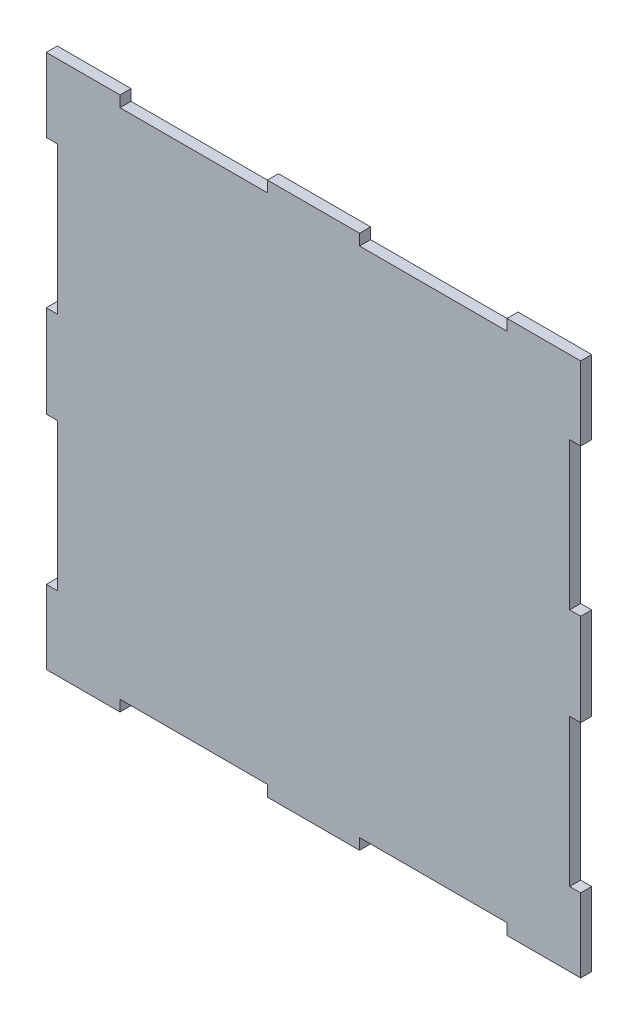
ISO-10303-21;
HEADER;
FILE_DESCRIPTION(('STEP AP214'),'2;1');
FILE_NAME('part.step','',(''),(''),'','','');
FILE_SCHEMA(('AUTOMOTIVE_DESIGN { 1 0 10303 214 1 1 1 1 }'));
ENDSEC;
DATA;
#1=APPLICATION_CONTEXT('core data for automotive mechanical design processes');
#2=APPLICATION_PROTOCOL_DEFINITION('international standard','automotive_design',2000,#1);
#3=PRODUCT_CONTEXT('',#1,'mechanical');
#4=PRODUCT('Part','Part','',(#3));
#5=PRODUCT_RELATED_PRODUCT_CATEGORY('part','',(#4));
#6=PRODUCT_DEFINITION_FORMATION('','',#4);
#7=PRODUCT_DEFINITION_CONTEXT('part definition',#1,'design');
#8=PRODUCT_DEFINITION('design','',#6,#7);
#9=PRODUCT_DEFINITION_SHAPE('','',#8);
#10=(LENGTH_UNIT() NAMED_UNIT(*) SI_UNIT(.MILLI.,.METRE.));
#11=(NAMED_UNIT(*) PLANE_ANGLE_UNIT() SI_UNIT($,.RADIAN.));
#12=(NAMED_UNIT(*) SI_UNIT($,.STERADIAN.) SOLID_ANGLE_UNIT());
#13=UNCERTAINTY_MEASURE_WITH_UNIT(LENGTH_MEASURE(1.E-05),#10,'distance_accuracy_value','');
#14=(GEOMETRIC_REPRESENTATION_CONTEXT(3) GLOBAL_UNCERTAINTY_ASSIGNED_CONTEXT((#13)) GLOBAL_UNIT_ASSIGNED_CONTEXT((#10,
#11,#12)) REPRESENTATION_CONTEXT('',''));
#15=CARTESIAN_POINT('',(0.,0.,0.));
#16=DIRECTION('',(0.,0.,1.));
#17=DIRECTION('',(1.,0.,0.));
#18=AXIS2_PLACEMENT_3D('',#15,#16,#17);
#19=CARTESIAN_POINT('',(72.5,72.5,3.));
#20=DIRECTION('',(-1.,0.,0.));
#21=DIRECTION('',(0.,-1.,0.));
#22=AXIS2_PLACEMENT_3D('',#19,#20,#21);
#23=PLANE('',#22);
#24=DIRECTION('',(0.,1.,0.));
#25=VECTOR('',#24,1.);
#26=CARTESIAN_POINT('',(72.5,72.5,3.));
#27=LINE('',#26,#25);
#28=CARTESIAN_POINT('',(72.5,-12.5,3.));
#29=VERTEX_POINT('',#28);
#30=CARTESIAN_POINT('',(72.5,12.5,3.));
#31=VERTEX_POINT('',#30);
#32=EDGE_CURVE('E378',#29,#31,#27,.T.);
#33=ORIENTED_EDGE('',*,*,#32,.F.);
#34=DIRECTION('',(0.,0.,1.));
#35=VECTOR('',#34,1.);
#36=CARTESIAN_POINT('',(72.5,-12.5,0.));
#37=LINE('',#36,#35);
#38=CARTESIAN_POINT('',(72.5,-12.5,0.));
#39=VERTEX_POINT('',#38);
#40=EDGE_CURVE('E407',#39,#29,#37,.T.);
#41=ORIENTED_EDGE('',*,*,#40,.F.);
#42=DIRECTION('',(0.,1.,0.));
#43=VECTOR('',#42,1.);
#44=CARTESIAN_POINT('',(72.5,72.5,0.));
#45=LINE('',#44,#43);
#46=CARTESIAN_POINT('',(72.5,12.5,0.));
#47=VERTEX_POINT('',#46);
#48=EDGE_CURVE('E346',#39,#47,#45,.T.);
#49=ORIENTED_EDGE('',*,*,#48,.T.);
#50=DIRECTION('',(0.,0.,1.));
#51=VECTOR('',#50,1.);
#52=CARTESIAN_POINT('',(72.5,12.5,0.));
#53=LINE('',#52,#51);
#54=EDGE_CURVE('E439',#47,#31,#53,.T.);
#55=ORIENTED_EDGE('',*,*,#54,.T.);
#56=EDGE_LOOP('',(#33,#41,#49,#55));
#57=FACE_BOUND('',#56,.T.);
#58=ADVANCED_FACE('F33',(#57),#23,.F.);
#59=CARTESIAN_POINT('',(72.5,52.5,3.));
#60=VERTEX_POINT('',#59);
#61=CARTESIAN_POINT('',(72.5,72.5,3.));
#62=VERTEX_POINT('',#61);
#63=EDGE_CURVE('E299',#60,#62,#27,.T.);
#64=ORIENTED_EDGE('',*,*,#63,.F.);
#65=DIRECTION('',(0.,0.,1.));
#66=VECTOR('',#65,1.);
#67=CARTESIAN_POINT('',(72.5,52.5,0.));
#68=LINE('',#67,#66);
#69=CARTESIAN_POINT('',(72.5,52.5,0.));
#70=VERTEX_POINT('',#69);
#71=EDGE_CURVE('E436',#70,#60,#68,.T.);
#72=ORIENTED_EDGE('',*,*,#71,.F.);
#73=CARTESIAN_POINT('',(72.5,72.5,0.));
#74=VERTEX_POINT('',#73);
#75=EDGE_CURVE('E347',#70,#74,#45,.T.);
#76=ORIENTED_EDGE('',*,*,#75,.T.);
#77=DIRECTION('',(0.,0.,-1.));
#78=VECTOR('',#77,1.);
#79=CARTESIAN_POINT('',(72.5,72.5,3.));
#80=LINE('',#79,#78);
#81=EDGE_CURVE('E11',#62,#74,#80,.T.);
#82=ORIENTED_EDGE('',*,*,#81,.F.);
#83=EDGE_LOOP('',(#64,#72,#76,#82));
#84=FACE_BOUND('',#83,.T.);
#85=ADVANCED_FACE('F569',(#84),#23,.F.);
#86=CARTESIAN_POINT('',(-72.5,72.5,3.));
#87=DIRECTION('',(0.,-1.,0.));
#88=DIRECTION('',(0.,0.,-1.));
#89=AXIS2_PLACEMENT_3D('',#86,#87,#88);
#90=PLANE('',#89);
#91=DIRECTION('',(-1.,0.,0.));
#92=VECTOR('',#91,1.);
#93=CARTESIAN_POINT('',(-72.5,72.5,3.));
#94=LINE('',#93,#92);
#95=CARTESIAN_POINT('',(12.5,72.5,3.));
#96=VERTEX_POINT('',#95);
#97=CARTESIAN_POINT('',(-12.5,72.5,3.));
#98=VERTEX_POINT('',#97);
#99=EDGE_CURVE('E383',#96,#98,#94,.T.);
#100=ORIENTED_EDGE('',*,*,#99,.F.);
#101=DIRECTION('',(0.,0.,1.));
#102=VECTOR('',#101,1.);
#103=CARTESIAN_POINT('',(12.5,72.5,0.));
#104=LINE('',#103,#102);
#105=CARTESIAN_POINT('',(12.5,72.5,0.));
#106=VERTEX_POINT('',#105);
#107=EDGE_CURVE('E462',#106,#96,#104,.T.);
#108=ORIENTED_EDGE('',*,*,#107,.F.);
#109=DIRECTION('',(-1.,0.,0.));
#110=VECTOR('',#109,1.);
#111=CARTESIAN_POINT('',(-72.5,72.5,0.));
#112=LINE('',#111,#110);
#113=CARTESIAN_POINT('',(-12.5,72.5,0.));
#114=VERTEX_POINT('',#113);
#115=EDGE_CURVE('E337',#106,#114,#112,.T.);
#116=ORIENTED_EDGE('',*,*,#115,.T.);
#117=DIRECTION('',(0.,0.,1.));
#118=VECTOR('',#117,1.);
#119=CARTESIAN_POINT('',(-12.5,72.5,0.));
#120=LINE('',#119,#118);
#121=EDGE_CURVE('E358',#114,#98,#120,.T.);
#122=ORIENTED_EDGE('',*,*,#121,.T.);
#123=EDGE_LOOP('',(#100,#108,#116,#122));
#124=FACE_BOUND('',#123,.T.);
#125=ADVANCED_FACE('F555',(#124),#90,.F.);
#126=CARTESIAN_POINT('',(-52.5,72.5,3.));
#127=VERTEX_POINT('',#126);
#128=CARTESIAN_POINT('',(-72.5,72.5,3.));
#129=VERTEX_POINT('',#128);
#130=EDGE_CURVE('E377',#127,#129,#94,.T.);
#131=ORIENTED_EDGE('',*,*,#130,.F.);
#132=DIRECTION('',(0.,0.,1.));
#133=VECTOR('',#132,1.);
#134=CARTESIAN_POINT('',(-52.5,72.5,0.));
#135=LINE('',#134,#133);
#136=CARTESIAN_POINT('',(-52.5,72.5,0.));
#137=VERTEX_POINT('',#136);
#138=EDGE_CURVE('E353',#137,#127,#135,.T.);
#139=ORIENTED_EDGE('',*,*,#138,.F.);
#140=CARTESIAN_POINT('',(-72.5,72.5,0.));
#141=VERTEX_POINT('',#140);
#142=EDGE_CURVE('E325',#137,#141,#112,.T.);
#143=ORIENTED_EDGE('',*,*,#142,.T.);
#144=DIRECTION('',(0.,0.,-1.));
#145=VECTOR('',#144,1.);
#146=CARTESIAN_POINT('',(-72.5,72.5,3.));
#147=LINE('',#146,#145);
#148=EDGE_CURVE('E41',#129,#141,#147,.T.);
#149=ORIENTED_EDGE('',*,*,#148,.F.);
#150=EDGE_LOOP('',(#131,#139,#143,#149));
#151=FACE_BOUND('',#150,.T.);
#152=ADVANCED_FACE('F559',(#151),#90,.F.);
#153=CARTESIAN_POINT('',(-72.5,72.5,3.));
#154=DIRECTION('',(1.,0.,0.));
#155=DIRECTION('',(0.,0.,-1.));
#156=AXIS2_PLACEMENT_3D('',#153,#154,#155);
#157=PLANE('',#156);
#158=DIRECTION('',(0.,-1.,0.));
#159=VECTOR('',#158,1.);
#160=CARTESIAN_POINT('',(-72.5,72.5,0.));
#161=LINE('',#160,#159);
#162=CARTESIAN_POINT('',(-72.5,52.5,0.));
#163=VERTEX_POINT('',#162);
#164=EDGE_CURVE('E300',#141,#163,#161,.T.);
#165=ORIENTED_EDGE('',*,*,#164,.T.);
#166=DIRECTION('',(0.,0.,1.));
#167=VECTOR('',#166,1.);
#168=CARTESIAN_POINT('',(-72.5,52.5,0.));
#169=LINE('',#168,#167);
#170=CARTESIAN_POINT('',(-72.5,52.5,3.));
#171=VERTEX_POINT('',#170);
#172=EDGE_CURVE('E458',#163,#171,#169,.T.);
#173=ORIENTED_EDGE('',*,*,#172,.T.);
#174=DIRECTION('',(0.,-1.,0.));
#175=VECTOR('',#174,1.);
#176=CARTESIAN_POINT('',(-72.5,72.5,3.));
#177=LINE('',#176,#175);
#178=EDGE_CURVE('E319',#129,#171,#177,.T.);
#179=ORIENTED_EDGE('',*,*,#178,.F.);
#180=ORIENTED_EDGE('',*,*,#148,.T.);
#181=EDGE_LOOP('',(#165,#173,#179,#180));
#182=FACE_BOUND('',#181,.T.);
#183=ADVANCED_FACE('F316',(#182),#157,.F.);
#184=CARTESIAN_POINT('',(-72.5,12.5,3.));
#185=VERTEX_POINT('',#184);
#186=CARTESIAN_POINT('',(-72.5,-12.5,3.));
#187=VERTEX_POINT('',#186);
#188=EDGE_CURVE('E385',#185,#187,#177,.T.);
#189=ORIENTED_EDGE('',*,*,#188,.F.);
#190=DIRECTION('',(0.,0.,1.));
#191=VECTOR('',#190,1.);
#192=CARTESIAN_POINT('',(-72.5,12.5,0.));
#193=LINE('',#192,#191);
#194=CARTESIAN_POINT('',(-72.5,12.5,0.));
#195=VERTEX_POINT('',#194);
#196=EDGE_CURVE('E476',#195,#185,#193,.T.);
#197=ORIENTED_EDGE('',*,*,#196,.F.);
#198=CARTESIAN_POINT('',(-72.5,-12.5,0.));
#199=VERTEX_POINT('',#198);
#200=EDGE_CURVE('E328',#195,#199,#161,.T.);
#201=ORIENTED_EDGE('',*,*,#200,.T.);
#202=DIRECTION('',(0.,0.,1.));
#203=VECTOR('',#202,1.);
#204=CARTESIAN_POINT('',(-72.5,-12.5,0.));
#205=LINE('',#204,#203);
#206=EDGE_CURVE('E481',#199,#187,#205,.T.);
#207=ORIENTED_EDGE('',*,*,#206,.T.);
#208=EDGE_LOOP('',(#189,#197,#201,#207));
#209=FACE_BOUND('',#208,.T.);
#210=ADVANCED_FACE('F566',(#209),#157,.F.);
#211=CARTESIAN_POINT('',(-72.5,-72.5,3.));
#212=DIRECTION('',(0.,1.,0.));
#213=DIRECTION('',(0.,0.,1.));
#214=AXIS2_PLACEMENT_3D('',#211,#212,#213);
#215=PLANE('',#214);
#216=DIRECTION('',(1.,0.,0.));
#217=VECTOR('',#216,1.);
#218=CARTESIAN_POINT('',(-72.5,-72.5,0.));
#219=LINE('',#218,#217);
#220=CARTESIAN_POINT('',(-12.5,-72.5,0.));
#221=VERTEX_POINT('',#220);
#222=CARTESIAN_POINT('',(12.5,-72.5,0.));
#223=VERTEX_POINT('',#222);
#224=EDGE_CURVE('E284',#221,#223,#219,.T.);
#225=ORIENTED_EDGE('',*,*,#224,.T.);
#226=DIRECTION('',(0.,0.,1.));
#227=VECTOR('',#226,1.);
#228=CARTESIAN_POINT('',(12.5,-72.5,0.));
#229=LINE('',#228,#227);
#230=CARTESIAN_POINT('',(12.5,-72.5,3.));
#231=VERTEX_POINT('',#230);
#232=EDGE_CURVE('E506',#223,#231,#229,.T.);
#233=ORIENTED_EDGE('',*,*,#232,.T.);
#234=DIRECTION('',(1.,0.,0.));
#235=VECTOR('',#234,1.);
#236=CARTESIAN_POINT('',(-72.5,-72.5,3.));
#237=LINE('',#236,#235);
#238=CARTESIAN_POINT('',(-12.5,-72.5,3.));
#239=VERTEX_POINT('',#238);
#240=EDGE_CURVE('E286',#239,#231,#237,.T.);
#241=ORIENTED_EDGE('',*,*,#240,.F.);
#242=DIRECTION('',(0.,0.,1.));
#243=VECTOR('',#242,1.);
#244=CARTESIAN_POINT('',(-12.5,-72.5,0.));
#245=LINE('',#244,#243);
#246=EDGE_CURVE('E270',#221,#239,#245,.T.);
#247=ORIENTED_EDGE('',*,*,#246,.F.);
#248=EDGE_LOOP('',(#225,#233,#241,#247));
#249=FACE_BOUND('',#248,.T.);
#250=ADVANCED_FACE('F282',(#249),#215,.F.);
#251=CARTESIAN_POINT('',(-72.5,-72.5,0.));
#252=VERTEX_POINT('',#251);
#253=CARTESIAN_POINT('',(-52.5,-72.5,0.));
#254=VERTEX_POINT('',#253);
#255=EDGE_CURVE('E295',#252,#254,#219,.T.);
#256=ORIENTED_EDGE('',*,*,#255,.T.);
#257=DIRECTION('',(0.,0.,1.));
#258=VECTOR('',#257,1.);
#259=CARTESIAN_POINT('',(-52.5,-72.5,0.));
#260=LINE('',#259,#258);
#261=CARTESIAN_POINT('',(-52.5,-72.5,3.));
#262=VERTEX_POINT('',#261);
#263=EDGE_CURVE('E527',#254,#262,#260,.T.);
#264=ORIENTED_EDGE('',*,*,#263,.T.);
#265=CARTESIAN_POINT('',(-72.5,-72.5,3.));
#266=VERTEX_POINT('',#265);
#267=EDGE_CURVE('E308',#266,#262,#237,.T.);
#268=ORIENTED_EDGE('',*,*,#267,.F.);
#269=DIRECTION('',(0.,0.,-1.));
#270=VECTOR('',#269,1.);
#271=CARTESIAN_POINT('',(-72.5,-72.5,3.));
#272=LINE('',#271,#270);
#273=EDGE_CURVE('E307',#266,#252,#272,.T.);
#274=ORIENTED_EDGE('',*,*,#273,.T.);
#275=EDGE_LOOP('',(#256,#264,#268,#274));
#276=FACE_BOUND('',#275,.T.);
#277=ADVANCED_FACE('F578',(#276),#215,.F.);
#278=CARTESIAN_POINT('',(72.5,-72.5,0.));
#279=VERTEX_POINT('',#278);
#280=CARTESIAN_POINT('',(72.5,-52.5,0.));
#281=VERTEX_POINT('',#280);
#282=EDGE_CURVE('E343',#279,#281,#45,.T.);
#283=ORIENTED_EDGE('',*,*,#282,.T.);
#284=DIRECTION('',(0.,0.,1.));
#285=VECTOR('',#284,1.);
#286=CARTESIAN_POINT('',(72.5,-52.5,0.));
#287=LINE('',#286,#285);
#288=CARTESIAN_POINT('',(72.5,-52.5,3.));
#289=VERTEX_POINT('',#288);
#290=EDGE_CURVE('E404',#281,#289,#287,.T.);
#291=ORIENTED_EDGE('',*,*,#290,.T.);
#292=CARTESIAN_POINT('',(72.5,-72.5,3.));
#293=VERTEX_POINT('',#292);
#294=EDGE_CURVE('E374',#293,#289,#27,.T.);
#295=ORIENTED_EDGE('',*,*,#294,.F.);
#296=DIRECTION('',(0.,0.,-1.));
#297=VECTOR('',#296,1.);
#298=CARTESIAN_POINT('',(72.5,-72.5,3.));
#299=LINE('',#298,#297);
#300=EDGE_CURVE('E304',#293,#279,#299,.T.);
#301=ORIENTED_EDGE('',*,*,#300,.T.);
#302=EDGE_LOOP('',(#283,#291,#295,#301));
#303=FACE_BOUND('',#302,.T.);
#304=ADVANCED_FACE('F35',(#303),#23,.F.);
#305=CARTESIAN_POINT('',(52.5,72.5,0.));
#306=VERTEX_POINT('',#305);
#307=EDGE_CURVE('E331',#74,#306,#112,.T.);
#308=ORIENTED_EDGE('',*,*,#307,.T.);
#309=DIRECTION('',(0.,0.,1.));
#310=VECTOR('',#309,1.);
#311=CARTESIAN_POINT('',(52.5,72.5,0.));
#312=LINE('',#311,#310);
#313=CARTESIAN_POINT('',(52.5,72.5,3.));
#314=VERTEX_POINT('',#313);
#315=EDGE_CURVE('E465',#306,#314,#312,.T.);
#316=ORIENTED_EDGE('',*,*,#315,.T.);
#317=EDGE_CURVE('E379',#62,#314,#94,.T.);
#318=ORIENTED_EDGE('',*,*,#317,.F.);
#319=ORIENTED_EDGE('',*,*,#81,.T.);
#320=EDGE_LOOP('',(#308,#316,#318,#319));
#321=FACE_BOUND('',#320,.T.);
#322=ADVANCED_FACE('F561',(#321),#90,.F.);
#323=CARTESIAN_POINT('',(-72.5,-52.5,3.));
#324=VERTEX_POINT('',#323);
#325=EDGE_CURVE('E382',#324,#266,#177,.T.);
#326=ORIENTED_EDGE('',*,*,#325,.F.);
#327=DIRECTION('',(0.,0.,1.));
#328=VECTOR('',#327,1.);
#329=CARTESIAN_POINT('',(-72.5,-52.5,0.));
#330=LINE('',#329,#328);
#331=CARTESIAN_POINT('',(-72.5,-52.5,0.));
#332=VERTEX_POINT('',#331);
#333=EDGE_CURVE('E501',#332,#324,#330,.T.);
#334=ORIENTED_EDGE('',*,*,#333,.F.);
#335=EDGE_CURVE('E329',#332,#252,#161,.T.);
#336=ORIENTED_EDGE('',*,*,#335,.T.);
#337=ORIENTED_EDGE('',*,*,#273,.F.);
#338=EDGE_LOOP('',(#326,#334,#336,#337));
#339=FACE_BOUND('',#338,.T.);
#340=ADVANCED_FACE('F568',(#339),#157,.F.);
#341=CARTESIAN_POINT('',(52.5,-72.5,3.));
#342=VERTEX_POINT('',#341);
#343=EDGE_CURVE('E384',#342,#293,#237,.T.);
#344=ORIENTED_EDGE('',*,*,#343,.F.);
#345=DIRECTION('',(0.,0.,1.));
#346=VECTOR('',#345,1.);
#347=CARTESIAN_POINT('',(52.5,-72.5,0.));
#348=LINE('',#347,#346);
#349=CARTESIAN_POINT('',(52.5,-72.5,0.));
#350=VERTEX_POINT('',#349);
#351=EDGE_CURVE('E524',#350,#342,#348,.T.);
#352=ORIENTED_EDGE('',*,*,#351,.F.);
#353=EDGE_CURVE('E296',#350,#279,#219,.T.);
#354=ORIENTED_EDGE('',*,*,#353,.T.);
#355=ORIENTED_EDGE('',*,*,#300,.F.);
#356=EDGE_LOOP('',(#344,#352,#354,#355));
#357=FACE_BOUND('',#356,.T.);
#358=ADVANCED_FACE('F402',(#357),#215,.F.);
#359=CARTESIAN_POINT('',(0.,0.,3.));
#360=DIRECTION('',(0.,0.,1.));
#361=DIRECTION('',(1.,0.,0.));
#362=AXIS2_PLACEMENT_3D('',#359,#360,#361);
#363=PLANE('',#362);
#364=DIRECTION('',(0.,-1.,0.));
#365=VECTOR('',#364,1.);
#366=CARTESIAN_POINT('',(12.5,72.5,3.));
#367=LINE('',#366,#365);
#368=CARTESIAN_POINT('',(12.5,69.5,3.));
#369=VERTEX_POINT('',#368);
#370=EDGE_CURVE('E454',#96,#369,#367,.T.);
#371=ORIENTED_EDGE('',*,*,#370,.F.);
#372=ORIENTED_EDGE('',*,*,#99,.T.);
#373=DIRECTION('',(0.,1.,0.));
#374=VECTOR('',#373,1.);
#375=CARTESIAN_POINT('',(-12.5,72.5,3.));
#376=LINE('',#375,#374);
#377=CARTESIAN_POINT('',(-12.5,69.5,3.));
#378=VERTEX_POINT('',#377);
#379=EDGE_CURVE('E367',#378,#98,#376,.T.);
#380=ORIENTED_EDGE('',*,*,#379,.F.);
#381=DIRECTION('',(1.,0.,0.));
#382=VECTOR('',#381,1.);
#383=CARTESIAN_POINT('',(-52.5,69.5,3.));
#384=LINE('',#383,#382);
#385=CARTESIAN_POINT('',(-52.5,69.5,3.));
#386=VERTEX_POINT('',#385);
#387=EDGE_CURVE('E544',#386,#378,#384,.T.);
#388=ORIENTED_EDGE('',*,*,#387,.F.);
#389=DIRECTION('',(0.,-1.,0.));
#390=VECTOR('',#389,1.);
#391=CARTESIAN_POINT('',(-52.5,72.5,3.));
#392=LINE('',#391,#390);
#393=EDGE_CURVE('E464',#127,#386,#392,.T.);
#394=ORIENTED_EDGE('',*,*,#393,.F.);
#395=ORIENTED_EDGE('',*,*,#130,.T.);
#396=ORIENTED_EDGE('',*,*,#178,.T.);
#397=DIRECTION('',(-1.,0.,0.));
#398=VECTOR('',#397,1.);
#399=CARTESIAN_POINT('',(-72.5,52.5,3.));
#400=LINE('',#399,#398);
#401=CARTESIAN_POINT('',(-69.5,52.5,3.));
#402=VERTEX_POINT('',#401);
#403=EDGE_CURVE('E473',#402,#171,#400,.T.);
#404=ORIENTED_EDGE('',*,*,#403,.F.);
#405=DIRECTION('',(0.,1.,0.));
#406=VECTOR('',#405,1.);
#407=CARTESIAN_POINT('',(-69.5,52.5,3.));
#408=LINE('',#407,#406);
#409=CARTESIAN_POINT('',(-69.5,12.5,3.));
#410=VERTEX_POINT('',#409);
#411=EDGE_CURVE('E480',#410,#402,#408,.T.);
#412=ORIENTED_EDGE('',*,*,#411,.F.);
#413=DIRECTION('',(1.,0.,0.));
#414=VECTOR('',#413,1.);
#415=CARTESIAN_POINT('',(-72.5,12.5,3.));
#416=LINE('',#415,#414);
#417=EDGE_CURVE('E477',#185,#410,#416,.T.);
#418=ORIENTED_EDGE('',*,*,#417,.F.);
#419=ORIENTED_EDGE('',*,*,#188,.T.);
#420=DIRECTION('',(-1.,0.,0.));
#421=VECTOR('',#420,1.);
#422=CARTESIAN_POINT('',(-72.5,-12.5,3.));
#423=LINE('',#422,#421);
#424=CARTESIAN_POINT('',(-69.5,-12.5,3.));
#425=VERTEX_POINT('',#424);
#426=EDGE_CURVE('E495',#425,#187,#423,.T.);
#427=ORIENTED_EDGE('',*,*,#426,.F.);
#428=DIRECTION('',(0.,1.,0.));
#429=VECTOR('',#428,1.);
#430=CARTESIAN_POINT('',(-69.5,-12.5,3.));
#431=LINE('',#430,#429);
#432=CARTESIAN_POINT('',(-69.5,-52.5,3.));
#433=VERTEX_POINT('',#432);
#434=EDGE_CURVE('E505',#433,#425,#431,.T.);
#435=ORIENTED_EDGE('',*,*,#434,.F.);
#436=DIRECTION('',(1.,0.,0.));
#437=VECTOR('',#436,1.);
#438=CARTESIAN_POINT('',(-72.5,-52.5,3.));
#439=LINE('',#438,#437);
#440=EDGE_CURVE('E502',#324,#433,#439,.T.);
#441=ORIENTED_EDGE('',*,*,#440,.F.);
#442=ORIENTED_EDGE('',*,*,#325,.T.);
#443=ORIENTED_EDGE('',*,*,#267,.T.);
#444=DIRECTION('',(0.,-1.,0.));
#445=VECTOR('',#444,1.);
#446=CARTESIAN_POINT('',(-52.5,-72.5,3.));
#447=LINE('',#446,#445);
#448=CARTESIAN_POINT('',(-52.5,-69.5,3.));
#449=VERTEX_POINT('',#448);
#450=EDGE_CURVE('E277',#449,#262,#447,.T.);
#451=ORIENTED_EDGE('',*,*,#450,.F.);
#452=DIRECTION('',(-1.,0.,0.));
#453=VECTOR('',#452,1.);
#454=CARTESIAN_POINT('',(-52.5,-69.5,3.));
#455=LINE('',#454,#453);
#456=CARTESIAN_POINT('',(-12.5,-69.5,3.));
#457=VERTEX_POINT('',#456);
#458=EDGE_CURVE('E743',#457,#449,#455,.T.);
#459=ORIENTED_EDGE('',*,*,#458,.F.);
#460=DIRECTION('',(0.,1.,0.));
#461=VECTOR('',#460,1.);
#462=CARTESIAN_POINT('',(-12.5,-72.5,3.));
#463=LINE('',#462,#461);
#464=EDGE_CURVE('E410',#239,#457,#463,.T.);
#465=ORIENTED_EDGE('',*,*,#464,.F.);
#466=ORIENTED_EDGE('',*,*,#240,.T.);
#467=DIRECTION('',(0.,-1.,0.));
#468=VECTOR('',#467,1.);
#469=CARTESIAN_POINT('',(12.5,-72.5,3.));
#470=LINE('',#469,#468);
#471=CARTESIAN_POINT('',(12.5,-69.5,3.));
#472=VERTEX_POINT('',#471);
#473=EDGE_CURVE('E521',#472,#231,#470,.T.);
#474=ORIENTED_EDGE('',*,*,#473,.F.);
#475=DIRECTION('',(-1.,0.,0.));
#476=VECTOR('',#475,1.);
#477=CARTESIAN_POINT('',(12.5,-69.5,3.));
#478=LINE('',#477,#476);
#479=CARTESIAN_POINT('',(52.5,-69.5,3.));
#480=VERTEX_POINT('',#479);
#481=EDGE_CURVE('E526',#480,#472,#478,.T.);
#482=ORIENTED_EDGE('',*,*,#481,.F.);
#483=DIRECTION('',(0.,1.,0.));
#484=VECTOR('',#483,1.);
#485=CARTESIAN_POINT('',(52.5,-72.5,3.));
#486=LINE('',#485,#484);
#487=EDGE_CURVE('E399',#342,#480,#486,.T.);
#488=ORIENTED_EDGE('',*,*,#487,.F.);
#489=ORIENTED_EDGE('',*,*,#343,.T.);
#490=ORIENTED_EDGE('',*,*,#294,.T.);
#491=DIRECTION('',(1.,0.,0.));
#492=VECTOR('',#491,1.);
#493=CARTESIAN_POINT('',(72.5,-52.5,3.));
#494=LINE('',#493,#492);
#495=CARTESIAN_POINT('',(69.5,-52.5,3.));
#496=VERTEX_POINT('',#495);
#497=EDGE_CURVE('E625',#496,#289,#494,.T.);
#498=ORIENTED_EDGE('',*,*,#497,.F.);
#499=DIRECTION('',(0.,-1.,0.));
#500=VECTOR('',#499,1.);
#501=CARTESIAN_POINT('',(69.5,-12.5,3.));
#502=LINE('',#501,#500);
#503=CARTESIAN_POINT('',(69.5,-12.5,3.));
#504=VERTEX_POINT('',#503);
#505=EDGE_CURVE('E631',#504,#496,#502,.T.);
#506=ORIENTED_EDGE('',*,*,#505,.F.);
#507=DIRECTION('',(-1.,0.,0.));
#508=VECTOR('',#507,1.);
#509=CARTESIAN_POINT('',(72.5,-12.5,3.));
#510=LINE('',#509,#508);
#511=EDGE_CURVE('E438',#29,#504,#510,.T.);
#512=ORIENTED_EDGE('',*,*,#511,.F.);
#513=ORIENTED_EDGE('',*,*,#32,.T.);
#514=DIRECTION('',(1.,0.,0.));
#515=VECTOR('',#514,1.);
#516=CARTESIAN_POINT('',(72.5,12.5,3.));
#517=LINE('',#516,#515);
#518=CARTESIAN_POINT('',(69.5,12.5,3.));
#519=VERTEX_POINT('',#518);
#520=EDGE_CURVE('E422',#519,#31,#517,.T.);
#521=ORIENTED_EDGE('',*,*,#520,.F.);
#522=DIRECTION('',(0.,-1.,0.));
#523=VECTOR('',#522,1.);
#524=CARTESIAN_POINT('',(69.5,52.5,3.));
#525=LINE('',#524,#523);
#526=CARTESIAN_POINT('',(69.5,52.5,3.));
#527=VERTEX_POINT('',#526);
#528=EDGE_CURVE('E432',#527,#519,#525,.T.);
#529=ORIENTED_EDGE('',*,*,#528,.F.);
#530=DIRECTION('',(-1.,0.,0.));
#531=VECTOR('',#530,1.);
#532=CARTESIAN_POINT('',(72.5,52.5,3.));
#533=LINE('',#532,#531);
#534=EDGE_CURVE('E429',#60,#527,#533,.T.);
#535=ORIENTED_EDGE('',*,*,#534,.F.);
#536=ORIENTED_EDGE('',*,*,#63,.T.);
#537=ORIENTED_EDGE('',*,*,#317,.T.);
#538=DIRECTION('',(0.,1.,0.));
#539=VECTOR('',#538,1.);
#540=CARTESIAN_POINT('',(52.5,72.5,3.));
#541=LINE('',#540,#539);
#542=CARTESIAN_POINT('',(52.5,69.5,3.));
#543=VERTEX_POINT('',#542);
#544=EDGE_CURVE('E449',#543,#314,#541,.T.);
#545=ORIENTED_EDGE('',*,*,#544,.F.);
#546=DIRECTION('',(1.,0.,0.));
#547=VECTOR('',#546,1.);
#548=CARTESIAN_POINT('',(12.5,69.5,3.));
#549=LINE('',#548,#547);
#550=EDGE_CURVE('E457',#369,#543,#549,.T.);
#551=ORIENTED_EDGE('',*,*,#550,.F.);
#552=EDGE_LOOP('',(#371,#372,#380,#388,#394,#395,#396,#404,#412,#418,#419,#427,#435,#441,#442,
#443,#451,#459,#465,#466,#474,#482,#488,#489,#490,#498,#506,#512,#513,#521,#529,#535,#536,#537,
#545,#551));
#553=FACE_BOUND('',#552,.T.);
#554=ADVANCED_FACE('F394',(#553),#363,.T.);
#555=CARTESIAN_POINT('',(0.,0.,0.));
#556=DIRECTION('',(0.,0.,1.));
#557=DIRECTION('',(1.,0.,0.));
#558=AXIS2_PLACEMENT_3D('',#555,#556,#557);
#559=PLANE('',#558);
#560=ORIENTED_EDGE('',*,*,#115,.F.);
#561=DIRECTION('',(0.,-1.,0.));
#562=VECTOR('',#561,1.);
#563=CARTESIAN_POINT('',(12.5,72.5,0.));
#564=LINE('',#563,#562);
#565=CARTESIAN_POINT('',(12.5,69.5,0.));
#566=VERTEX_POINT('',#565);
#567=EDGE_CURVE('E445',#106,#566,#564,.T.);
#568=ORIENTED_EDGE('',*,*,#567,.T.);
#569=DIRECTION('',(1.,0.,0.));
#570=VECTOR('',#569,1.);
#571=CARTESIAN_POINT('',(12.5,69.5,0.));
#572=LINE('',#571,#570);
#573=CARTESIAN_POINT('',(52.5,69.5,0.));
#574=VERTEX_POINT('',#573);
#575=EDGE_CURVE('E448',#566,#574,#572,.T.);
#576=ORIENTED_EDGE('',*,*,#575,.T.);
#577=DIRECTION('',(0.,1.,0.));
#578=VECTOR('',#577,1.);
#579=CARTESIAN_POINT('',(52.5,72.5,0.));
#580=LINE('',#579,#578);
#581=EDGE_CURVE('E48',#574,#306,#580,.T.);
#582=ORIENTED_EDGE('',*,*,#581,.T.);
#583=ORIENTED_EDGE('',*,*,#307,.F.);
#584=ORIENTED_EDGE('',*,*,#75,.F.);
#585=DIRECTION('',(-1.,0.,0.));
#586=VECTOR('',#585,1.);
#587=CARTESIAN_POINT('',(72.5,52.5,0.));
#588=LINE('',#587,#586);
#589=CARTESIAN_POINT('',(69.5,52.5,0.));
#590=VERTEX_POINT('',#589);
#591=EDGE_CURVE('E418',#70,#590,#588,.T.);
#592=ORIENTED_EDGE('',*,*,#591,.T.);
#593=DIRECTION('',(0.,-1.,0.));
#594=VECTOR('',#593,1.);
#595=CARTESIAN_POINT('',(69.5,52.5,0.));
#596=LINE('',#595,#594);
#597=CARTESIAN_POINT('',(69.5,12.5,0.));
#598=VERTEX_POINT('',#597);
#599=EDGE_CURVE('E421',#590,#598,#596,.T.);
#600=ORIENTED_EDGE('',*,*,#599,.T.);
#601=DIRECTION('',(1.,0.,0.));
#602=VECTOR('',#601,1.);
#603=CARTESIAN_POINT('',(72.5,12.5,0.));
#604=LINE('',#603,#602);
#605=EDGE_CURVE('E425',#598,#47,#604,.T.);
#606=ORIENTED_EDGE('',*,*,#605,.T.);
#607=ORIENTED_EDGE('',*,*,#48,.F.);
#608=DIRECTION('',(-1.,0.,0.));
#609=VECTOR('',#608,1.);
#610=CARTESIAN_POINT('',(72.5,-12.5,0.));
#611=LINE('',#610,#609);
#612=CARTESIAN_POINT('',(69.5,-12.5,0.));
#613=VERTEX_POINT('',#612);
#614=EDGE_CURVE('E621',#39,#613,#611,.T.);
#615=ORIENTED_EDGE('',*,*,#614,.T.);
#616=DIRECTION('',(0.,-1.,0.));
#617=VECTOR('',#616,1.);
#618=CARTESIAN_POINT('',(69.5,-12.5,0.));
#619=LINE('',#618,#617);
#620=CARTESIAN_POINT('',(69.5,-52.5,0.));
#621=VERTEX_POINT('',#620);
#622=EDGE_CURVE('E624',#613,#621,#619,.T.);
#623=ORIENTED_EDGE('',*,*,#622,.T.);
#624=DIRECTION('',(1.,0.,0.));
#625=VECTOR('',#624,1.);
#626=CARTESIAN_POINT('',(72.5,-52.5,0.));
#627=LINE('',#626,#625);
#628=EDGE_CURVE('E417',#621,#281,#627,.T.);
#629=ORIENTED_EDGE('',*,*,#628,.T.);
#630=ORIENTED_EDGE('',*,*,#282,.F.);
#631=ORIENTED_EDGE('',*,*,#353,.F.);
#632=DIRECTION('',(0.,1.,0.));
#633=VECTOR('',#632,1.);
#634=CARTESIAN_POINT('',(52.5,-72.5,0.));
#635=LINE('',#634,#633);
#636=CARTESIAN_POINT('',(52.5,-69.5,0.));
#637=VERTEX_POINT('',#636);
#638=EDGE_CURVE('E517',#350,#637,#635,.T.);
#639=ORIENTED_EDGE('',*,*,#638,.T.);
#640=DIRECTION('',(-1.,0.,0.));
#641=VECTOR('',#640,1.);
#642=CARTESIAN_POINT('',(12.5,-69.5,0.));
#643=LINE('',#642,#641);
#644=CARTESIAN_POINT('',(12.5,-69.5,0.));
#645=VERTEX_POINT('',#644);
#646=EDGE_CURVE('E520',#637,#645,#643,.T.);
#647=ORIENTED_EDGE('',*,*,#646,.T.);
#648=DIRECTION('',(0.,-1.,0.));
#649=VECTOR('',#648,1.);
#650=CARTESIAN_POINT('',(12.5,-72.5,0.));
#651=LINE('',#650,#649);
#652=EDGE_CURVE('E294',#645,#223,#651,.T.);
#653=ORIENTED_EDGE('',*,*,#652,.T.);
#654=ORIENTED_EDGE('',*,*,#224,.F.);
#655=DIRECTION('',(0.,1.,0.));
#656=VECTOR('',#655,1.);
#657=CARTESIAN_POINT('',(-12.5,-72.5,0.));
#658=LINE('',#657,#656);
#659=CARTESIAN_POINT('',(-12.5,-69.5,0.));
#660=VERTEX_POINT('',#659);
#661=EDGE_CURVE('E266',#221,#660,#658,.T.);
#662=ORIENTED_EDGE('',*,*,#661,.T.);
#663=DIRECTION('',(-1.,0.,0.));
#664=VECTOR('',#663,1.);
#665=CARTESIAN_POINT('',(-52.5,-69.5,0.));
#666=LINE('',#665,#664);
#667=CARTESIAN_POINT('',(-52.5,-69.5,0.));
#668=VERTEX_POINT('',#667);
#669=EDGE_CURVE('E276',#660,#668,#666,.T.);
#670=ORIENTED_EDGE('',*,*,#669,.T.);
#671=DIRECTION('',(0.,-1.,0.));
#672=VECTOR('',#671,1.);
#673=CARTESIAN_POINT('',(-52.5,-72.5,0.));
#674=LINE('',#673,#672);
#675=EDGE_CURVE('E287',#668,#254,#674,.T.);
#676=ORIENTED_EDGE('',*,*,#675,.T.);
#677=ORIENTED_EDGE('',*,*,#255,.F.);
#678=ORIENTED_EDGE('',*,*,#335,.F.);
#679=DIRECTION('',(1.,0.,0.));
#680=VECTOR('',#679,1.);
#681=CARTESIAN_POINT('',(-72.5,-52.5,0.));
#682=LINE('',#681,#680);
#683=CARTESIAN_POINT('',(-69.5,-52.5,0.));
#684=VERTEX_POINT('',#683);
#685=EDGE_CURVE('E491',#332,#684,#682,.T.);
#686=ORIENTED_EDGE('',*,*,#685,.T.);
#687=DIRECTION('',(0.,1.,0.));
#688=VECTOR('',#687,1.);
#689=CARTESIAN_POINT('',(-69.5,-12.5,0.));
#690=LINE('',#689,#688);
#691=CARTESIAN_POINT('',(-69.5,-12.5,0.));
#692=VERTEX_POINT('',#691);
#693=EDGE_CURVE('E494',#684,#692,#690,.T.);
#694=ORIENTED_EDGE('',*,*,#693,.T.);
#695=DIRECTION('',(-1.,0.,0.));
#696=VECTOR('',#695,1.);
#697=CARTESIAN_POINT('',(-72.5,-12.5,0.));
#698=LINE('',#697,#696);
#699=EDGE_CURVE('E498',#692,#199,#698,.T.);
#700=ORIENTED_EDGE('',*,*,#699,.T.);
#701=ORIENTED_EDGE('',*,*,#200,.F.);
#702=DIRECTION('',(1.,0.,0.));
#703=VECTOR('',#702,1.);
#704=CARTESIAN_POINT('',(-72.5,12.5,0.));
#705=LINE('',#704,#703);
#706=CARTESIAN_POINT('',(-69.5,12.5,0.));
#707=VERTEX_POINT('',#706);
#708=EDGE_CURVE('E470',#195,#707,#705,.T.);
#709=ORIENTED_EDGE('',*,*,#708,.T.);
#710=DIRECTION('',(0.,1.,0.));
#711=VECTOR('',#710,1.);
#712=CARTESIAN_POINT('',(-69.5,52.5,0.));
#713=LINE('',#712,#711);
#714=CARTESIAN_POINT('',(-69.5,52.5,0.));
#715=VERTEX_POINT('',#714);
#716=EDGE_CURVE('E56',#707,#715,#713,.T.);
#717=ORIENTED_EDGE('',*,*,#716,.T.);
#718=DIRECTION('',(-1.,0.,0.));
#719=VECTOR('',#718,1.);
#720=CARTESIAN_POINT('',(-72.5,52.5,0.));
#721=LINE('',#720,#719);
#722=EDGE_CURVE('E327',#715,#163,#721,.T.);
#723=ORIENTED_EDGE('',*,*,#722,.T.);
#724=ORIENTED_EDGE('',*,*,#164,.F.);
#725=ORIENTED_EDGE('',*,*,#142,.F.);
#726=DIRECTION('',(0.,-1.,0.));
#727=VECTOR('',#726,1.);
#728=CARTESIAN_POINT('',(-52.5,72.5,0.));
#729=LINE('',#728,#727);
#730=CARTESIAN_POINT('',(-52.5,69.5,0.));
#731=VERTEX_POINT('',#730);
#732=EDGE_CURVE('E537',#137,#731,#729,.T.);
#733=ORIENTED_EDGE('',*,*,#732,.T.);
#734=DIRECTION('',(1.,0.,0.));
#735=VECTOR('',#734,1.);
#736=CARTESIAN_POINT('',(-52.5,69.5,0.));
#737=LINE('',#736,#735);
#738=CARTESIAN_POINT('',(-12.5,69.5,0.));
#739=VERTEX_POINT('',#738);
#740=EDGE_CURVE('E539',#731,#739,#737,.T.);
#741=ORIENTED_EDGE('',*,*,#740,.T.);
#742=DIRECTION('',(0.,1.,0.));
#743=VECTOR('',#742,1.);
#744=CARTESIAN_POINT('',(-12.5,72.5,0.));
#745=LINE('',#744,#743);
#746=EDGE_CURVE('E373',#739,#114,#745,.T.);
#747=ORIENTED_EDGE('',*,*,#746,.T.);
#748=EDGE_LOOP('',(#560,#568,#576,#582,#583,#584,#592,#600,#606,#607,#615,#623,#629,#630,#631,
#639,#647,#653,#654,#662,#670,#676,#677,#678,#686,#694,#700,#701,#709,#717,#723,#724,#725,#733,
#741,#747));
#749=FACE_BOUND('',#748,.T.);
#750=ADVANCED_FACE('F291',(#749),#559,.F.);
#751=CARTESIAN_POINT('',(-52.5,72.5,0.));
#752=DIRECTION('',(-1.,0.,0.));
#753=DIRECTION('',(0.,0.,1.));
#754=AXIS2_PLACEMENT_3D('',#751,#752,#753);
#755=PLANE('',#754);
#756=ORIENTED_EDGE('',*,*,#393,.T.);
#757=DIRECTION('',(0.,0.,1.));
#758=VECTOR('',#757,1.);
#759=CARTESIAN_POINT('',(-52.5,69.5,0.));
#760=LINE('',#759,#758);
#761=EDGE_CURVE('E371',#731,#386,#760,.T.);
#762=ORIENTED_EDGE('',*,*,#761,.F.);
#763=ORIENTED_EDGE('',*,*,#732,.F.);
#764=ORIENTED_EDGE('',*,*,#138,.T.);
#765=EDGE_LOOP('',(#756,#762,#763,#764));
#766=FACE_BOUND('',#765,.T.);
#767=ADVANCED_FACE('F665',(#766),#755,.F.);
#768=CARTESIAN_POINT('',(-12.5,72.5,0.));
#769=DIRECTION('',(1.,0.,0.));
#770=DIRECTION('',(0.,0.,-1.));
#771=AXIS2_PLACEMENT_3D('',#768,#769,#770);
#772=PLANE('',#771);
#773=ORIENTED_EDGE('',*,*,#379,.T.);
#774=ORIENTED_EDGE('',*,*,#121,.F.);
#775=ORIENTED_EDGE('',*,*,#746,.F.);
#776=DIRECTION('',(0.,0.,1.));
#777=VECTOR('',#776,1.);
#778=CARTESIAN_POINT('',(-12.5,69.5,0.));
#779=LINE('',#778,#777);
#780=EDGE_CURVE('E364',#739,#378,#779,.T.);
#781=ORIENTED_EDGE('',*,*,#780,.T.);
#782=EDGE_LOOP('',(#773,#774,#775,#781));
#783=FACE_BOUND('',#782,.T.);
#784=ADVANCED_FACE('F551',(#783),#772,.F.);
#785=CARTESIAN_POINT('',(-52.5,69.5,0.));
#786=DIRECTION('',(0.,-1.,0.));
#787=DIRECTION('',(0.,0.,-1.));
#788=AXIS2_PLACEMENT_3D('',#785,#786,#787);
#789=PLANE('',#788);
#790=ORIENTED_EDGE('',*,*,#387,.T.);
#791=ORIENTED_EDGE('',*,*,#780,.F.);
#792=ORIENTED_EDGE('',*,*,#740,.F.);
#793=ORIENTED_EDGE('',*,*,#761,.T.);
#794=EDGE_LOOP('',(#790,#791,#792,#793));
#795=FACE_BOUND('',#794,.T.);
#796=ADVANCED_FACE('F664',(#795),#789,.F.);
#797=CARTESIAN_POINT('',(72.5,52.5,0.));
#798=DIRECTION('',(0.,1.,0.));
#799=DIRECTION('',(-1.,0.,0.));
#800=AXIS2_PLACEMENT_3D('',#797,#798,#799);
#801=PLANE('',#800);
#802=ORIENTED_EDGE('',*,*,#534,.T.);
#803=DIRECTION('',(0.,0.,1.));
#804=VECTOR('',#803,1.);
#805=CARTESIAN_POINT('',(69.5,52.5,0.));
#806=LINE('',#805,#804);
#807=EDGE_CURVE('E428',#590,#527,#806,.T.);
#808=ORIENTED_EDGE('',*,*,#807,.F.);
#809=ORIENTED_EDGE('',*,*,#591,.F.);
#810=ORIENTED_EDGE('',*,*,#71,.T.);
#811=EDGE_LOOP('',(#802,#808,#809,#810));
#812=FACE_BOUND('',#811,.T.);
#813=ADVANCED_FACE('F675',(#812),#801,.F.);
#814=CARTESIAN_POINT('',(72.5,12.5,0.));
#815=DIRECTION('',(0.,-1.,0.));
#816=DIRECTION('',(0.,0.,-1.));
#817=AXIS2_PLACEMENT_3D('',#814,#815,#816);
#818=PLANE('',#817);
#819=ORIENTED_EDGE('',*,*,#520,.T.);
#820=ORIENTED_EDGE('',*,*,#54,.F.);
#821=ORIENTED_EDGE('',*,*,#605,.F.);
#822=DIRECTION('',(0.,0.,1.));
#823=VECTOR('',#822,1.);
#824=CARTESIAN_POINT('',(69.5,12.5,0.));
#825=LINE('',#824,#823);
#826=EDGE_CURVE('E442',#598,#519,#825,.T.);
#827=ORIENTED_EDGE('',*,*,#826,.T.);
#828=EDGE_LOOP('',(#819,#820,#821,#827));
#829=FACE_BOUND('',#828,.T.);
#830=ADVANCED_FACE('F648',(#829),#818,.F.);
#831=CARTESIAN_POINT('',(69.5,52.5,0.));
#832=DIRECTION('',(-1.,0.,0.));
#833=DIRECTION('',(0.,-1.,0.));
#834=AXIS2_PLACEMENT_3D('',#831,#832,#833);
#835=PLANE('',#834);
#836=ORIENTED_EDGE('',*,*,#528,.T.);
#837=ORIENTED_EDGE('',*,*,#826,.F.);
#838=ORIENTED_EDGE('',*,*,#599,.F.);
#839=ORIENTED_EDGE('',*,*,#807,.T.);
#840=EDGE_LOOP('',(#836,#837,#838,#839));
#841=FACE_BOUND('',#840,.T.);
#842=ADVANCED_FACE('F650',(#841),#835,.F.);
#843=CARTESIAN_POINT('',(72.5,-12.5,0.));
#844=DIRECTION('',(0.,1.,0.));
#845=DIRECTION('',(0.,0.,1.));
#846=AXIS2_PLACEMENT_3D('',#843,#844,#845);
#847=PLANE('',#846);
#848=ORIENTED_EDGE('',*,*,#511,.T.);
#849=DIRECTION('',(0.,0.,1.));
#850=VECTOR('',#849,1.);
#851=CARTESIAN_POINT('',(69.5,-12.5,0.));
#852=LINE('',#851,#850);
#853=EDGE_CURVE('E412',#613,#504,#852,.T.);
#854=ORIENTED_EDGE('',*,*,#853,.F.);
#855=ORIENTED_EDGE('',*,*,#614,.F.);
#856=ORIENTED_EDGE('',*,*,#40,.T.);
#857=EDGE_LOOP('',(#848,#854,#855,#856));
#858=FACE_BOUND('',#857,.T.);
#859=ADVANCED_FACE('F642',(#858),#847,.F.);
#860=CARTESIAN_POINT('',(72.5,-52.5,0.));
#861=DIRECTION('',(0.,-1.,0.));
#862=DIRECTION('',(1.,0.,0.));
#863=AXIS2_PLACEMENT_3D('',#860,#861,#862);
#864=PLANE('',#863);
#865=ORIENTED_EDGE('',*,*,#497,.T.);
#866=ORIENTED_EDGE('',*,*,#290,.F.);
#867=ORIENTED_EDGE('',*,*,#628,.F.);
#868=DIRECTION('',(0.,0.,1.));
#869=VECTOR('',#868,1.);
#870=CARTESIAN_POINT('',(69.5,-52.5,0.));
#871=LINE('',#870,#869);
#872=EDGE_CURVE('E408',#621,#496,#871,.T.);
#873=ORIENTED_EDGE('',*,*,#872,.T.);
#874=EDGE_LOOP('',(#865,#866,#867,#873));
#875=FACE_BOUND('',#874,.T.);
#876=ADVANCED_FACE('F633',(#875),#864,.F.);
#877=CARTESIAN_POINT('',(69.5,-12.5,0.));
#878=DIRECTION('',(-1.,0.,0.));
#879=DIRECTION('',(0.,-1.,0.));
#880=AXIS2_PLACEMENT_3D('',#877,#878,#879);
#881=PLANE('',#880);
#882=ORIENTED_EDGE('',*,*,#505,.T.);
#883=ORIENTED_EDGE('',*,*,#872,.F.);
#884=ORIENTED_EDGE('',*,*,#622,.F.);
#885=ORIENTED_EDGE('',*,*,#853,.T.);
#886=EDGE_LOOP('',(#882,#883,#884,#885));
#887=FACE_BOUND('',#886,.T.);
#888=ADVANCED_FACE('F639',(#887),#881,.F.);
#889=CARTESIAN_POINT('',(-52.5,-72.5,0.));
#890=DIRECTION('',(-1.,0.,0.));
#891=DIRECTION('',(0.,0.,1.));
#892=AXIS2_PLACEMENT_3D('',#889,#890,#891);
#893=PLANE('',#892);
#894=ORIENTED_EDGE('',*,*,#450,.T.);
#895=ORIENTED_EDGE('',*,*,#263,.F.);
#896=ORIENTED_EDGE('',*,*,#675,.F.);
#897=DIRECTION('',(0.,0.,1.));
#898=VECTOR('',#897,1.);
#899=CARTESIAN_POINT('',(-52.5,-69.5,0.));
#900=LINE('',#899,#898);
#901=EDGE_CURVE('E614',#668,#449,#900,.T.);
#902=ORIENTED_EDGE('',*,*,#901,.T.);
#903=EDGE_LOOP('',(#894,#895,#896,#902));
#904=FACE_BOUND('',#903,.T.);
#905=ADVANCED_FACE('F729',(#904),#893,.F.);
#906=CARTESIAN_POINT('',(-52.5,-69.5,0.));
#907=DIRECTION('',(0.,1.,0.));
#908=DIRECTION('',(-1.,0.,0.));
#909=AXIS2_PLACEMENT_3D('',#906,#907,#908);
#910=PLANE('',#909);
#911=ORIENTED_EDGE('',*,*,#458,.T.);
#912=ORIENTED_EDGE('',*,*,#901,.F.);
#913=ORIENTED_EDGE('',*,*,#669,.F.);
#914=DIRECTION('',(0.,0.,1.));
#915=VECTOR('',#914,1.);
#916=CARTESIAN_POINT('',(-12.5,-69.5,0.));
#917=LINE('',#916,#915);
#918=EDGE_CURVE('E272',#660,#457,#917,.T.);
#919=ORIENTED_EDGE('',*,*,#918,.T.);
#920=EDGE_LOOP('',(#911,#912,#913,#919));
#921=FACE_BOUND('',#920,.T.);
#922=ADVANCED_FACE('F734',(#921),#910,.F.);
#923=CARTESIAN_POINT('',(-12.5,-72.5,0.));
#924=DIRECTION('',(1.,0.,0.));
#925=DIRECTION('',(0.,0.,-1.));
#926=AXIS2_PLACEMENT_3D('',#923,#924,#925);
#927=PLANE('',#926);
#928=ORIENTED_EDGE('',*,*,#464,.T.);
#929=ORIENTED_EDGE('',*,*,#918,.F.);
#930=ORIENTED_EDGE('',*,*,#661,.F.);
#931=ORIENTED_EDGE('',*,*,#246,.T.);
#932=EDGE_LOOP('',(#928,#929,#930,#931));
#933=FACE_BOUND('',#932,.T.);
#934=ADVANCED_FACE('F269',(#933),#927,.F.);
#935=CARTESIAN_POINT('',(12.5,-72.5,0.));
#936=DIRECTION('',(-1.,0.,0.));
#937=DIRECTION('',(0.,0.,1.));
#938=AXIS2_PLACEMENT_3D('',#935,#936,#937);
#939=PLANE('',#938);
#940=ORIENTED_EDGE('',*,*,#473,.T.);
#941=ORIENTED_EDGE('',*,*,#232,.F.);
#942=ORIENTED_EDGE('',*,*,#652,.F.);
#943=DIRECTION('',(0.,0.,1.));
#944=VECTOR('',#943,1.);
#945=CARTESIAN_POINT('',(12.5,-69.5,0.));
#946=LINE('',#945,#944);
#947=EDGE_CURVE('E532',#645,#472,#946,.T.);
#948=ORIENTED_EDGE('',*,*,#947,.T.);
#949=EDGE_LOOP('',(#940,#941,#942,#948));
#950=FACE_BOUND('',#949,.T.);
#951=ADVANCED_FACE('F685',(#950),#939,.F.);
#952=CARTESIAN_POINT('',(12.5,-69.5,0.));
#953=DIRECTION('',(0.,1.,0.));
#954=DIRECTION('',(-1.,0.,0.));
#955=AXIS2_PLACEMENT_3D('',#952,#953,#954);
#956=PLANE('',#955);
#957=ORIENTED_EDGE('',*,*,#481,.T.);
#958=ORIENTED_EDGE('',*,*,#947,.F.);
#959=ORIENTED_EDGE('',*,*,#646,.F.);
#960=DIRECTION('',(0.,0.,1.));
#961=VECTOR('',#960,1.);
#962=CARTESIAN_POINT('',(52.5,-69.5,0.));
#963=LINE('',#962,#961);
#964=EDGE_CURVE('E534',#637,#480,#963,.T.);
#965=ORIENTED_EDGE('',*,*,#964,.T.);
#966=EDGE_LOOP('',(#957,#958,#959,#965));
#967=FACE_BOUND('',#966,.T.);
#968=ADVANCED_FACE('F681',(#967),#956,.F.);
#969=CARTESIAN_POINT('',(52.5,-72.5,0.));
#970=DIRECTION('',(1.,0.,0.));
#971=DIRECTION('',(0.,0.,-1.));
#972=AXIS2_PLACEMENT_3D('',#969,#970,#971);
#973=PLANE('',#972);
#974=ORIENTED_EDGE('',*,*,#487,.T.);
#975=ORIENTED_EDGE('',*,*,#964,.F.);
#976=ORIENTED_EDGE('',*,*,#638,.F.);
#977=ORIENTED_EDGE('',*,*,#351,.T.);
#978=EDGE_LOOP('',(#974,#975,#976,#977));
#979=FACE_BOUND('',#978,.T.);
#980=ADVANCED_FACE('F677',(#979),#973,.F.);
#981=CARTESIAN_POINT('',(-72.5,-12.5,0.));
#982=DIRECTION('',(0.,1.,0.));
#983=DIRECTION('',(0.,0.,1.));
#984=AXIS2_PLACEMENT_3D('',#981,#982,#983);
#985=PLANE('',#984);
#986=ORIENTED_EDGE('',*,*,#426,.T.);
#987=ORIENTED_EDGE('',*,*,#206,.F.);
#988=ORIENTED_EDGE('',*,*,#699,.F.);
#989=DIRECTION('',(0.,0.,1.));
#990=VECTOR('',#989,1.);
#991=CARTESIAN_POINT('',(-69.5,-12.5,0.));
#992=LINE('',#991,#990);
#993=EDGE_CURVE('E512',#692,#425,#992,.T.);
#994=ORIENTED_EDGE('',*,*,#993,.T.);
#995=EDGE_LOOP('',(#986,#987,#988,#994));
#996=FACE_BOUND('',#995,.T.);
#997=ADVANCED_FACE('F680',(#996),#985,.F.);
#998=CARTESIAN_POINT('',(-69.5,-12.5,0.));
#999=DIRECTION('',(1.,0.,0.));
#1000=DIRECTION('',(0.,1.,0.));
#1001=AXIS2_PLACEMENT_3D('',#998,#999,#1000);
#1002=PLANE('',#1001);
#1003=ORIENTED_EDGE('',*,*,#434,.T.);
#1004=ORIENTED_EDGE('',*,*,#993,.F.);
#1005=ORIENTED_EDGE('',*,*,#693,.F.);
#1006=DIRECTION('',(0.,0.,1.));
#1007=VECTOR('',#1006,1.);
#1008=CARTESIAN_POINT('',(-69.5,-52.5,0.));
#1009=LINE('',#1008,#1007);
#1010=EDGE_CURVE('E514',#684,#433,#1009,.T.);
#1011=ORIENTED_EDGE('',*,*,#1010,.T.);
#1012=EDGE_LOOP('',(#1003,#1004,#1005,#1011));
#1013=FACE_BOUND('',#1012,.T.);
#1014=ADVANCED_FACE('F694',(#1013),#1002,.F.);
#1015=CARTESIAN_POINT('',(-72.5,-52.5,0.));
#1016=DIRECTION('',(0.,-1.,0.));
#1017=DIRECTION('',(1.,0.,0.));
#1018=AXIS2_PLACEMENT_3D('',#1015,#1016,#1017);
#1019=PLANE('',#1018);
#1020=ORIENTED_EDGE('',*,*,#440,.T.);
#1021=ORIENTED_EDGE('',*,*,#1010,.F.);
#1022=ORIENTED_EDGE('',*,*,#685,.F.);
#1023=ORIENTED_EDGE('',*,*,#333,.T.);
#1024=EDGE_LOOP('',(#1020,#1021,#1022,#1023));
#1025=FACE_BOUND('',#1024,.T.);
#1026=ADVANCED_FACE('F690',(#1025),#1019,.F.);
#1027=CARTESIAN_POINT('',(-72.5,52.5,0.));
#1028=DIRECTION('',(0.,1.,0.));
#1029=DIRECTION('',(-1.,0.,0.));
#1030=AXIS2_PLACEMENT_3D('',#1027,#1028,#1029);
#1031=PLANE('',#1030);
#1032=ORIENTED_EDGE('',*,*,#403,.T.);
#1033=ORIENTED_EDGE('',*,*,#172,.F.);
#1034=ORIENTED_EDGE('',*,*,#722,.F.);
#1035=DIRECTION('',(0.,0.,1.));
#1036=VECTOR('',#1035,1.);
#1037=CARTESIAN_POINT('',(-69.5,52.5,0.));
#1038=LINE('',#1037,#1036);
#1039=EDGE_CURVE('E486',#715,#402,#1038,.T.);
#1040=ORIENTED_EDGE('',*,*,#1039,.T.);
#1041=EDGE_LOOP('',(#1032,#1033,#1034,#1040));
#1042=FACE_BOUND('',#1041,.T.);
#1043=ADVANCED_FACE('F693',(#1042),#1031,.F.);
#1044=CARTESIAN_POINT('',(-69.5,52.5,0.));
#1045=DIRECTION('',(1.,0.,0.));
#1046=DIRECTION('',(0.,1.,0.));
#1047=AXIS2_PLACEMENT_3D('',#1044,#1045,#1046);
#1048=PLANE('',#1047);
#1049=ORIENTED_EDGE('',*,*,#411,.T.);
#1050=ORIENTED_EDGE('',*,*,#1039,.F.);
#1051=ORIENTED_EDGE('',*,*,#716,.F.);
#1052=DIRECTION('',(0.,0.,1.));
#1053=VECTOR('',#1052,1.);
#1054=CARTESIAN_POINT('',(-69.5,12.5,0.));
#1055=LINE('',#1054,#1053);
#1056=EDGE_CURVE('E488',#707,#410,#1055,.T.);
#1057=ORIENTED_EDGE('',*,*,#1056,.T.);
#1058=EDGE_LOOP('',(#1049,#1050,#1051,#1057));
#1059=FACE_BOUND('',#1058,.T.);
#1060=ADVANCED_FACE('F705',(#1059),#1048,.F.);
#1061=CARTESIAN_POINT('',(-72.5,12.5,0.));
#1062=DIRECTION('',(0.,-1.,0.));
#1063=DIRECTION('',(0.,0.,-1.));
#1064=AXIS2_PLACEMENT_3D('',#1061,#1062,#1063);
#1065=PLANE('',#1064);
#1066=ORIENTED_EDGE('',*,*,#417,.T.);
#1067=ORIENTED_EDGE('',*,*,#1056,.F.);
#1068=ORIENTED_EDGE('',*,*,#708,.F.);
#1069=ORIENTED_EDGE('',*,*,#196,.T.);
#1070=EDGE_LOOP('',(#1066,#1067,#1068,#1069));
#1071=FACE_BOUND('',#1070,.T.);
#1072=ADVANCED_FACE('F702',(#1071),#1065,.F.);
#1073=CARTESIAN_POINT('',(12.5,72.5,0.));
#1074=DIRECTION('',(-1.,0.,0.));
#1075=DIRECTION('',(0.,0.,1.));
#1076=AXIS2_PLACEMENT_3D('',#1073,#1074,#1075);
#1077=PLANE('',#1076);
#1078=ORIENTED_EDGE('',*,*,#370,.T.);
#1079=DIRECTION('',(0.,0.,1.));
#1080=VECTOR('',#1079,1.);
#1081=CARTESIAN_POINT('',(12.5,69.5,0.));
#1082=LINE('',#1081,#1080);
#1083=EDGE_CURVE('E453',#566,#369,#1082,.T.);
#1084=ORIENTED_EDGE('',*,*,#1083,.F.);
#1085=ORIENTED_EDGE('',*,*,#567,.F.);
#1086=ORIENTED_EDGE('',*,*,#107,.T.);
#1087=EDGE_LOOP('',(#1078,#1084,#1085,#1086));
#1088=FACE_BOUND('',#1087,.T.);
#1089=ADVANCED_FACE('F662',(#1088),#1077,.F.);
#1090=CARTESIAN_POINT('',(52.5,72.5,0.));
#1091=DIRECTION('',(1.,0.,0.));
#1092=DIRECTION('',(0.,0.,-1.));
#1093=AXIS2_PLACEMENT_3D('',#1090,#1091,#1092);
#1094=PLANE('',#1093);
#1095=ORIENTED_EDGE('',*,*,#544,.T.);
#1096=ORIENTED_EDGE('',*,*,#315,.F.);
#1097=ORIENTED_EDGE('',*,*,#581,.F.);
#1098=DIRECTION('',(0.,0.,1.));
#1099=VECTOR('',#1098,1.);
#1100=CARTESIAN_POINT('',(52.5,69.5,0.));
#1101=LINE('',#1100,#1099);
#1102=EDGE_CURVE('E467',#574,#543,#1101,.T.);
#1103=ORIENTED_EDGE('',*,*,#1102,.T.);
#1104=EDGE_LOOP('',(#1095,#1096,#1097,#1103));
#1105=FACE_BOUND('',#1104,.T.);
#1106=ADVANCED_FACE('F657',(#1105),#1094,.F.);
#1107=CARTESIAN_POINT('',(12.5,69.5,0.));
#1108=DIRECTION('',(0.,-1.,0.));
#1109=DIRECTION('',(0.,0.,-1.));
#1110=AXIS2_PLACEMENT_3D('',#1107,#1108,#1109);
#1111=PLANE('',#1110);
#1112=ORIENTED_EDGE('',*,*,#550,.T.);
#1113=ORIENTED_EDGE('',*,*,#1102,.F.);
#1114=ORIENTED_EDGE('',*,*,#575,.F.);
#1115=ORIENTED_EDGE('',*,*,#1083,.T.);
#1116=EDGE_LOOP('',(#1112,#1113,#1114,#1115));
#1117=FACE_BOUND('',#1116,.T.);
#1118=ADVANCED_FACE('F660',(#1117),#1111,.F.);
#1119=CLOSED_SHELL('',(#58,#85,#125,#152,#183,#210,#250,#277,#304,#322,#340,#358,#554,#750,#767,
#784,#796,#813,#830,#842,#859,#876,#888,#905,#922,#934,#951,#968,#980,#997,#1014,#1026,#1043,
#1060,#1072,#1089,#1106,#1118));
#1120=MANIFOLD_SOLID_BREP('B2',#1119);
#1121=ADVANCED_BREP_SHAPE_REPRESENTATION('',(#18,#1120),#14);
#1122=SHAPE_DEFINITION_REPRESENTATION(#9,#1121);
ENDSEC;
END-ISO-10303-21;
